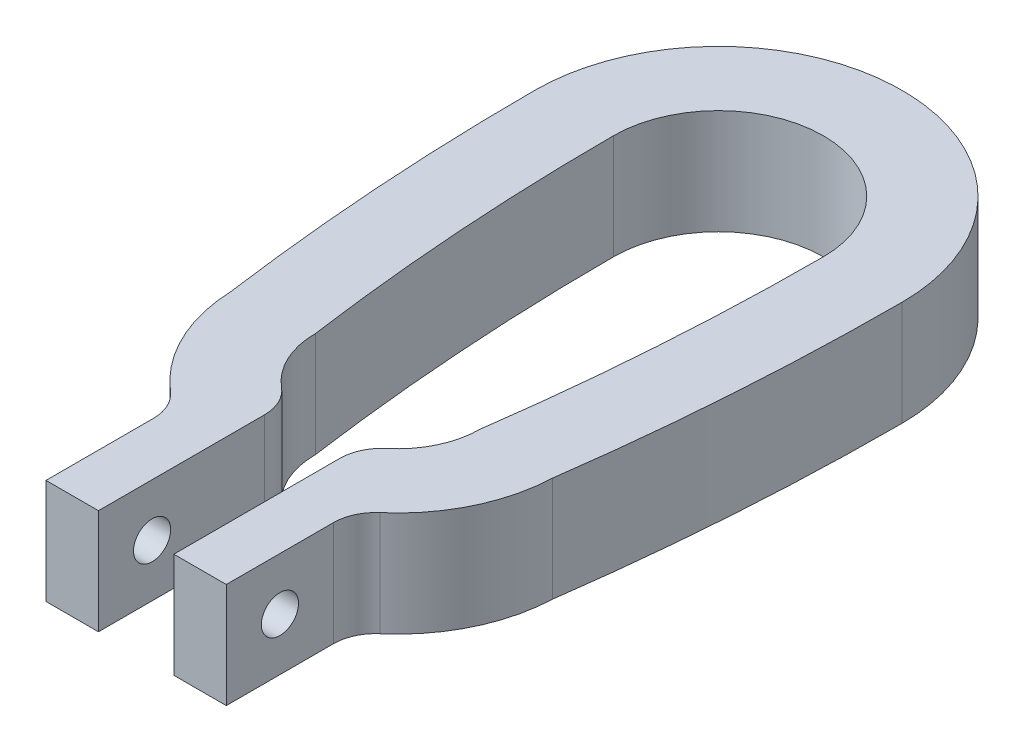
ISO-10303-21;
HEADER;
FILE_DESCRIPTION(('STEP AP214'),'2;1');
FILE_NAME('part.step','',(''),(''),'','','');
FILE_SCHEMA(('AUTOMOTIVE_DESIGN { 1 0 10303 214 1 1 1 1 }'));
ENDSEC;
DATA;
#1=APPLICATION_CONTEXT('core data for automotive mechanical design processes');
#2=APPLICATION_PROTOCOL_DEFINITION('international standard','automotive_design',2000,#1);
#3=PRODUCT_CONTEXT('',#1,'mechanical');
#4=PRODUCT('Part','Part','',(#3));
#5=PRODUCT_RELATED_PRODUCT_CATEGORY('part','',(#4));
#6=PRODUCT_DEFINITION_FORMATION('','',#4);
#7=PRODUCT_DEFINITION_CONTEXT('part definition',#1,'design');
#8=PRODUCT_DEFINITION('design','',#6,#7);
#9=PRODUCT_DEFINITION_SHAPE('','',#8);
#10=(LENGTH_UNIT() NAMED_UNIT(*) SI_UNIT(.MILLI.,.METRE.));
#11=(NAMED_UNIT(*) PLANE_ANGLE_UNIT() SI_UNIT($,.RADIAN.));
#12=(NAMED_UNIT(*) SI_UNIT($,.STERADIAN.) SOLID_ANGLE_UNIT());
#13=UNCERTAINTY_MEASURE_WITH_UNIT(LENGTH_MEASURE(1.E-05),#10,'distance_accuracy_value','');
#14=(GEOMETRIC_REPRESENTATION_CONTEXT(3) GLOBAL_UNCERTAINTY_ASSIGNED_CONTEXT((#13)) GLOBAL_UNIT_ASSIGNED_CONTEXT((#10,
#11,#12)) REPRESENTATION_CONTEXT('',''));
#15=CARTESIAN_POINT('',(0.,0.,0.));
#16=DIRECTION('',(0.,0.,1.));
#17=DIRECTION('',(1.,0.,0.));
#18=AXIS2_PLACEMENT_3D('',#15,#16,#17);
#19=CARTESIAN_POINT('',(0.,12.7,38.8063346560106));
#20=DIRECTION('',(0.,-1.,0.));
#21=DIRECTION('',(0.,0.,-1.));
#22=AXIS2_PLACEMENT_3D('',#19,#20,#21);
#23=CYLINDRICAL_SURFACE('',#22,10.);
#24=CARTESIAN_POINT('',(0.,0.,38.8063346560106));
#25=DIRECTION('',(0.,1.,0.));
#26=DIRECTION('',(0.,0.,1.));
#27=AXIS2_PLACEMENT_3D('',#24,#25,#26);
#28=CIRCLE('',#27,10.);
#29=CARTESIAN_POINT('',(6.3942154467292,0.,46.4948981642877));
#30=VERTEX_POINT('',#29);
#31=CARTESIAN_POINT('',(9.99999999999984,0.,38.8063346560106));
#32=VERTEX_POINT('',#31);
#33=EDGE_CURVE('E219',#30,#32,#28,.T.);
#34=ORIENTED_EDGE('',*,*,#33,.F.);
#35=DIRECTION('',(0.,-1.,0.));
#36=VECTOR('',#35,1.);
#37=CARTESIAN_POINT('',(6.3942154467292,12.7,46.4948981642877));
#38=LINE('',#37,#36);
#39=CARTESIAN_POINT('',(6.3942154467292,12.7,46.4948981642877));
#40=VERTEX_POINT('',#39);
#41=EDGE_CURVE('E11',#40,#30,#38,.T.);
#42=ORIENTED_EDGE('',*,*,#41,.F.);
#43=CARTESIAN_POINT('',(0.,12.7,38.8063346560106));
#44=DIRECTION('',(0.,1.,0.));
#45=DIRECTION('',(0.,0.,1.));
#46=AXIS2_PLACEMENT_3D('',#43,#44,#45);
#47=CIRCLE('',#46,10.);
#48=CARTESIAN_POINT('',(9.99999999999984,12.7,38.8063346560106));
#49=VERTEX_POINT('',#48);
#50=EDGE_CURVE('E291',#40,#49,#47,.T.);
#51=ORIENTED_EDGE('',*,*,#50,.T.);
#52=DIRECTION('',(0.,-1.,0.));
#53=VECTOR('',#52,1.);
#54=CARTESIAN_POINT('',(9.99999999999984,12.7,38.8063346560106));
#55=LINE('',#54,#53);
#56=EDGE_CURVE('E218',#49,#32,#55,.T.);
#57=ORIENTED_EDGE('',*,*,#56,.T.);
#58=EDGE_LOOP('',(#34,#42,#51,#57));
#59=FACE_BOUND('',#58,.T.);
#60=ADVANCED_FACE('F44',(#59),#23,.F.);
#61=CARTESIAN_POINT('',(9.64247689366763,12.7,50.4006884264925));
#62=DIRECTION('',(0.,-1.,0.));
#63=DIRECTION('',(0.,0.,-1.));
#64=AXIS2_PLACEMENT_3D('',#61,#62,#63);
#65=CYLINDRICAL_SURFACE('',#64,5.08);
#66=CARTESIAN_POINT('',(9.64247689366763,0.,50.4006884264925));
#67=DIRECTION('',(0.,-1.,0.));
#68=DIRECTION('',(0.,0.,-1.));
#69=AXIS2_PLACEMENT_3D('',#66,#67,#68);
#70=CIRCLE('',#69,5.08);
#71=CARTESIAN_POINT('',(4.56247689366763,0.,50.4006884264925));
#72=VERTEX_POINT('',#71);
#73=EDGE_CURVE('E289',#72,#30,#70,.T.);
#74=ORIENTED_EDGE('',*,*,#73,.F.);
#75=DIRECTION('',(0.,-1.,0.));
#76=VECTOR('',#75,1.);
#77=CARTESIAN_POINT('',(4.56247689366763,12.7,50.4006884264925));
#78=LINE('',#77,#76);
#79=CARTESIAN_POINT('',(4.56247689366763,12.7,50.4006884264925));
#80=VERTEX_POINT('',#79);
#81=EDGE_CURVE('E54',#80,#72,#78,.T.);
#82=ORIENTED_EDGE('',*,*,#81,.F.);
#83=CARTESIAN_POINT('',(9.64247689366763,12.7,50.4006884264925));
#84=DIRECTION('',(0.,-1.,0.));
#85=DIRECTION('',(0.,0.,-1.));
#86=AXIS2_PLACEMENT_3D('',#83,#84,#85);
#87=CIRCLE('',#86,5.08);
#88=EDGE_CURVE('E193',#80,#40,#87,.T.);
#89=ORIENTED_EDGE('',*,*,#88,.T.);
#90=ORIENTED_EDGE('',*,*,#41,.T.);
#91=EDGE_LOOP('',(#74,#82,#89,#90));
#92=FACE_BOUND('',#91,.T.);
#93=ADVANCED_FACE('F353',(#92),#65,.T.);
#94=CARTESIAN_POINT('',(4.56247689366763,12.7,57.7907869682252));
#95=DIRECTION('',(-1.,0.,0.));
#96=DIRECTION('',(0.,0.,1.));
#97=AXIS2_PLACEMENT_3D('',#94,#95,#96);
#98=PLANE('',#97);
#99=CARTESIAN_POINT('',(4.56247689366762,6.35,63.9979820215499));
#100=DIRECTION('',(-1.,0.,0.));
#101=DIRECTION('',(0.,0.,1.));
#102=AXIS2_PLACEMENT_3D('',#99,#100,#101);
#103=CIRCLE('',#102,2.249999945);
#104=CARTESIAN_POINT('',(4.56247689366762,6.35,66.2479819665499));
#105=VERTEX_POINT('',#104);
#106=EDGE_CURVE('E223',#105,#105,#103,.T.);
#107=ORIENTED_EDGE('',*,*,#106,.F.);
#108=EDGE_LOOP('',(#107));
#109=FACE_BOUND('',#108,.T.);
#110=DIRECTION('',(0.,0.,-1.));
#111=VECTOR('',#110,1.);
#112=CARTESIAN_POINT('',(4.56247689366763,0.,57.7907869682252));
#113=LINE('',#112,#111);
#114=CARTESIAN_POINT('',(4.56247689366764,0.,70.4907869682252));
#115=VERTEX_POINT('',#114);
#116=EDGE_CURVE('E199',#115,#72,#113,.T.);
#117=ORIENTED_EDGE('',*,*,#116,.F.);
#118=DIRECTION('',(0.,-1.,0.));
#119=VECTOR('',#118,1.);
#120=CARTESIAN_POINT('',(4.56247689366764,12.7,70.4907869682252));
#121=LINE('',#120,#119);
#122=CARTESIAN_POINT('',(4.56247689366764,12.7,70.4907869682252));
#123=VERTEX_POINT('',#122);
#124=EDGE_CURVE('E196',#123,#115,#121,.T.);
#125=ORIENTED_EDGE('',*,*,#124,.F.);
#126=DIRECTION('',(0.,0.,1.));
#127=VECTOR('',#126,1.);
#128=CARTESIAN_POINT('',(4.56247689366763,12.7,57.7907869682252));
#129=LINE('',#128,#127);
#130=EDGE_CURVE('E189',#80,#123,#129,.T.);
#131=ORIENTED_EDGE('',*,*,#130,.F.);
#132=ORIENTED_EDGE('',*,*,#81,.T.);
#133=EDGE_LOOP('',(#117,#125,#131,#132));
#134=FACE_BOUND('',#133,.T.);
#135=ADVANCED_FACE('F200',(#109,#134),#98,.T.);
#136=CARTESIAN_POINT('',(4.56247689366764,12.7,70.4907869682252));
#137=DIRECTION('',(0.,0.,-1.));
#138=DIRECTION('',(-1.,0.,0.));
#139=AXIS2_PLACEMENT_3D('',#136,#137,#138);
#140=PLANE('',#139);
#141=DIRECTION('',(1.,0.,0.));
#142=VECTOR('',#141,1.);
#143=CARTESIAN_POINT('',(4.56247689366764,0.,70.4907869682252));
#144=LINE('',#143,#142);
#145=CARTESIAN_POINT('',(10.9124768936676,0.,70.4907869682252));
#146=VERTEX_POINT('',#145);
#147=EDGE_CURVE('E283',#115,#146,#144,.T.);
#148=ORIENTED_EDGE('',*,*,#147,.T.);
#149=DIRECTION('',(0.,-1.,0.));
#150=VECTOR('',#149,1.);
#151=CARTESIAN_POINT('',(10.9124768936676,12.7,70.4907869682252));
#152=LINE('',#151,#150);
#153=CARTESIAN_POINT('',(10.9124768936676,12.7,70.4907869682252));
#154=VERTEX_POINT('',#153);
#155=EDGE_CURVE('E204',#154,#146,#152,.T.);
#156=ORIENTED_EDGE('',*,*,#155,.F.);
#157=DIRECTION('',(1.,0.,0.));
#158=VECTOR('',#157,1.);
#159=CARTESIAN_POINT('',(4.56247689366764,12.7,70.4907869682252));
#160=LINE('',#159,#158);
#161=EDGE_CURVE('E195',#123,#154,#160,.T.);
#162=ORIENTED_EDGE('',*,*,#161,.F.);
#163=ORIENTED_EDGE('',*,*,#124,.T.);
#164=EDGE_LOOP('',(#148,#156,#162,#163));
#165=FACE_BOUND('',#164,.T.);
#166=ADVANCED_FACE('F206',(#165),#140,.F.);
#167=CARTESIAN_POINT('',(10.9124768936676,12.7,70.4907869682252));
#168=DIRECTION('',(-1.,0.,0.));
#169=DIRECTION('',(0.,0.,1.));
#170=AXIS2_PLACEMENT_3D('',#167,#168,#169);
#171=PLANE('',#170);
#172=CARTESIAN_POINT('',(10.9124768936677,6.35,63.9979820215499));
#173=DIRECTION('',(-1.,0.,0.));
#174=DIRECTION('',(0.,0.,1.));
#175=AXIS2_PLACEMENT_3D('',#172,#173,#174);
#176=CIRCLE('',#175,2.249999945);
#177=CARTESIAN_POINT('',(10.9124768936677,6.35,66.2479819665499));
#178=VERTEX_POINT('',#177);
#179=EDGE_CURVE('E452',#178,#178,#176,.T.);
#180=ORIENTED_EDGE('',*,*,#179,.T.);
#181=EDGE_LOOP('',(#180));
#182=FACE_BOUND('',#181,.T.);
#183=DIRECTION('',(0.,0.,-1.));
#184=VECTOR('',#183,1.);
#185=CARTESIAN_POINT('',(10.9124768936676,0.,70.4907869682252));
#186=LINE('',#185,#184);
#187=CARTESIAN_POINT('',(10.9124768936676,0.,57.5051770748746));
#188=VERTEX_POINT('',#187);
#189=EDGE_CURVE('E285',#146,#188,#186,.T.);
#190=ORIENTED_EDGE('',*,*,#189,.T.);
#191=DIRECTION('',(0.,-1.,0.));
#192=VECTOR('',#191,1.);
#193=CARTESIAN_POINT('',(10.9124768936676,12.7,57.5051770748746));
#194=LINE('',#193,#192);
#195=CARTESIAN_POINT('',(10.9124768936676,12.7,57.5051770748746));
#196=VERTEX_POINT('',#195);
#197=EDGE_CURVE('E296',#196,#188,#194,.T.);
#198=ORIENTED_EDGE('',*,*,#197,.F.);
#199=DIRECTION('',(0.,0.,-1.));
#200=VECTOR('',#199,1.);
#201=CARTESIAN_POINT('',(10.9124768936676,12.7,70.4907869682252));
#202=LINE('',#201,#200);
#203=EDGE_CURVE('E209',#154,#196,#202,.T.);
#204=ORIENTED_EDGE('',*,*,#203,.F.);
#205=ORIENTED_EDGE('',*,*,#155,.T.);
#206=EDGE_LOOP('',(#190,#198,#204,#205));
#207=FACE_BOUND('',#206,.T.);
#208=ADVANCED_FACE('F369',(#182,#207),#171,.F.);
#209=CARTESIAN_POINT('',(15.9924768936676,12.7,57.5051770748746));
#210=DIRECTION('',(0.,-1.,0.));
#211=DIRECTION('',(0.,0.,-1.));
#212=AXIS2_PLACEMENT_3D('',#209,#210,#211);
#213=CYLINDRICAL_SURFACE('',#212,5.08);
#214=CARTESIAN_POINT('',(15.9924768936676,0.,57.5051770748746));
#215=DIRECTION('',(0.,-1.,0.));
#216=DIRECTION('',(0.,0.,-1.));
#217=AXIS2_PLACEMENT_3D('',#214,#215,#216);
#218=CIRCLE('',#217,5.08);
#219=CARTESIAN_POINT('',(12.6906365108255,0.,53.644574779088));
#220=VERTEX_POINT('',#219);
#221=EDGE_CURVE('E276',#188,#220,#218,.T.);
#222=ORIENTED_EDGE('',*,*,#221,.T.);
#223=DIRECTION('',(0.,-1.,0.));
#224=VECTOR('',#223,1.);
#225=CARTESIAN_POINT('',(12.6906365108255,12.7,53.644574779088));
#226=LINE('',#225,#224);
#227=CARTESIAN_POINT('',(12.6906365108255,12.7,53.644574779088));
#228=VERTEX_POINT('',#227);
#229=EDGE_CURVE('E302',#228,#220,#226,.T.);
#230=ORIENTED_EDGE('',*,*,#229,.F.);
#231=CARTESIAN_POINT('',(15.9924768936676,12.7,57.5051770748746));
#232=DIRECTION('',(0.,-1.,0.));
#233=DIRECTION('',(0.,0.,-1.));
#234=AXIS2_PLACEMENT_3D('',#231,#232,#233);
#235=CIRCLE('',#234,5.08);
#236=EDGE_CURVE('E213',#196,#228,#235,.T.);
#237=ORIENTED_EDGE('',*,*,#236,.F.);
#238=ORIENTED_EDGE('',*,*,#197,.T.);
#239=EDGE_LOOP('',(#222,#230,#237,#238));
#240=FACE_BOUND('',#239,.T.);
#241=ADVANCED_FACE('F375',(#240),#213,.F.);
#242=CARTESIAN_POINT('',(0.,12.7,38.8063346560106));
#243=DIRECTION('',(0.,-1.,0.));
#244=DIRECTION('',(0.,0.,-1.));
#245=AXIS2_PLACEMENT_3D('',#242,#243,#244);
#246=CYLINDRICAL_SURFACE('',#245,19.5250000000001);
#247=CARTESIAN_POINT('',(0.,0.,38.8063346560106));
#248=DIRECTION('',(0.,1.,0.));
#249=DIRECTION('',(0.,0.,1.));
#250=AXIS2_PLACEMENT_3D('',#247,#248,#249);
#251=CIRCLE('',#250,19.5250000000001);
#252=CARTESIAN_POINT('',(19.5099501596431,0.,39.5728004205738));
#253=VERTEX_POINT('',#252);
#254=EDGE_CURVE('E274',#220,#253,#251,.T.);
#255=ORIENTED_EDGE('',*,*,#254,.T.);
#256=DIRECTION('',(0.,-1.,0.));
#257=VECTOR('',#256,1.);
#258=CARTESIAN_POINT('',(19.5099501596431,12.7,39.5728004205738));
#259=LINE('',#258,#257);
#260=CARTESIAN_POINT('',(19.5099501596431,12.7,39.5728004205738));
#261=VERTEX_POINT('',#260);
#262=EDGE_CURVE('E307',#261,#253,#259,.T.);
#263=ORIENTED_EDGE('',*,*,#262,.F.);
#264=CARTESIAN_POINT('',(0.,12.7,38.8063346560106));
#265=DIRECTION('',(0.,1.,0.));
#266=DIRECTION('',(0.,0.,1.));
#267=AXIS2_PLACEMENT_3D('',#264,#265,#266);
#268=CIRCLE('',#267,19.5250000000001);
#269=EDGE_CURVE('E507',#228,#261,#268,.T.);
#270=ORIENTED_EDGE('',*,*,#269,.F.);
#271=ORIENTED_EDGE('',*,*,#229,.T.);
#272=EDGE_LOOP('',(#255,#263,#270,#271));
#273=FACE_BOUND('',#272,.T.);
#274=ADVANCED_FACE('F376',(#273),#246,.T.);
#275=CARTESIAN_POINT('',(-267.526223969285,12.7,1.59594559789866E-13));
#276=DIRECTION('',(0.,-1.,0.));
#277=DIRECTION('',(0.,0.,-1.));
#278=AXIS2_PLACEMENT_3D('',#275,#276,#277);
#279=CYLINDRICAL_SURFACE('',#278,289.751223969285);
#280=CARTESIAN_POINT('',(-267.526223969285,0.,1.59594559789866E-13));
#281=DIRECTION('',(0.,-1.,0.));
#282=DIRECTION('',(0.,0.,-1.));
#283=AXIS2_PLACEMENT_3D('',#280,#281,#282);
#284=CIRCLE('',#283,289.751223969285);
#285=CARTESIAN_POINT('',(22.2250000000002,0.,0.));
#286=VERTEX_POINT('',#285);
#287=EDGE_CURVE('E271',#286,#253,#284,.T.);
#288=ORIENTED_EDGE('',*,*,#287,.F.);
#289=DIRECTION('',(0.,-1.,0.));
#290=VECTOR('',#289,1.);
#291=CARTESIAN_POINT('',(22.2250000000002,12.7,0.));
#292=LINE('',#291,#290);
#293=CARTESIAN_POINT('',(22.2250000000002,12.7,0.));
#294=VERTEX_POINT('',#293);
#295=EDGE_CURVE('E309',#294,#286,#292,.T.);
#296=ORIENTED_EDGE('',*,*,#295,.F.);
#297=CARTESIAN_POINT('',(-267.526223969285,12.7,1.59594559789866E-13));
#298=DIRECTION('',(0.,-1.,0.));
#299=DIRECTION('',(0.,0.,-1.));
#300=AXIS2_PLACEMENT_3D('',#297,#298,#299);
#301=CIRCLE('',#300,289.751223969285);
#302=EDGE_CURVE('E501',#294,#261,#301,.T.);
#303=ORIENTED_EDGE('',*,*,#302,.T.);
#304=ORIENTED_EDGE('',*,*,#262,.T.);
#305=EDGE_LOOP('',(#288,#296,#303,#304));
#306=FACE_BOUND('',#305,.T.);
#307=ADVANCED_FACE('F379',(#306),#279,.T.);
#308=CARTESIAN_POINT('',(0.,12.7,0.));
#309=DIRECTION('',(0.,-1.,0.));
#310=DIRECTION('',(0.,0.,-1.));
#311=AXIS2_PLACEMENT_3D('',#308,#309,#310);
#312=CYLINDRICAL_SURFACE('',#311,22.225);
#313=CARTESIAN_POINT('',(0.,0.,0.));
#314=DIRECTION('',(0.,1.,0.));
#315=DIRECTION('',(0.,0.,1.));
#316=AXIS2_PLACEMENT_3D('',#313,#314,#315);
#317=CIRCLE('',#316,22.225);
#318=CARTESIAN_POINT('',(-22.225,0.,0.));
#319=VERTEX_POINT('',#318);
#320=EDGE_CURVE('E268',#286,#319,#317,.T.);
#321=ORIENTED_EDGE('',*,*,#320,.T.);
#322=DIRECTION('',(0.,-1.,0.));
#323=VECTOR('',#322,1.);
#324=CARTESIAN_POINT('',(-22.225,12.7,0.));
#325=LINE('',#324,#323);
#326=CARTESIAN_POINT('',(-22.225,12.7,0.));
#327=VERTEX_POINT('',#326);
#328=EDGE_CURVE('E311',#327,#319,#325,.T.);
#329=ORIENTED_EDGE('',*,*,#328,.F.);
#330=CARTESIAN_POINT('',(0.,12.7,0.));
#331=DIRECTION('',(0.,1.,0.));
#332=DIRECTION('',(0.,0.,1.));
#333=AXIS2_PLACEMENT_3D('',#330,#331,#332);
#334=CIRCLE('',#333,22.225);
#335=EDGE_CURVE('E502',#294,#327,#334,.T.);
#336=ORIENTED_EDGE('',*,*,#335,.F.);
#337=ORIENTED_EDGE('',*,*,#295,.T.);
#338=EDGE_LOOP('',(#321,#329,#336,#337));
#339=FACE_BOUND('',#338,.T.);
#340=ADVANCED_FACE('F383',(#339),#312,.T.);
#341=CARTESIAN_POINT('',(267.526223969285,12.7,0.));
#342=DIRECTION('',(0.,-1.,0.));
#343=DIRECTION('',(0.,0.,-1.));
#344=AXIS2_PLACEMENT_3D('',#341,#342,#343);
#345=CYLINDRICAL_SURFACE('',#344,289.751223969285);
#346=CARTESIAN_POINT('',(267.526223969285,0.,0.));
#347=DIRECTION('',(0.,1.,0.));
#348=DIRECTION('',(0.,0.,1.));
#349=AXIS2_PLACEMENT_3D('',#346,#347,#348);
#350=CIRCLE('',#349,289.751223969285);
#351=CARTESIAN_POINT('',(-19.509950159643,0.,39.5728004205737));
#352=VERTEX_POINT('',#351);
#353=EDGE_CURVE('E264',#319,#352,#350,.T.);
#354=ORIENTED_EDGE('',*,*,#353,.T.);
#355=DIRECTION('',(0.,-1.,0.));
#356=VECTOR('',#355,1.);
#357=CARTESIAN_POINT('',(-19.509950159643,12.7,39.5728004205737));
#358=LINE('',#357,#356);
#359=CARTESIAN_POINT('',(-19.509950159643,12.7,39.5728004205737));
#360=VERTEX_POINT('',#359);
#361=EDGE_CURVE('E320',#360,#352,#358,.T.);
#362=ORIENTED_EDGE('',*,*,#361,.F.);
#363=CARTESIAN_POINT('',(267.526223969285,12.7,0.));
#364=DIRECTION('',(0.,1.,0.));
#365=DIRECTION('',(0.,0.,1.));
#366=AXIS2_PLACEMENT_3D('',#363,#364,#365);
#367=CIRCLE('',#366,289.751223969285);
#368=EDGE_CURVE('E499',#327,#360,#367,.T.);
#369=ORIENTED_EDGE('',*,*,#368,.F.);
#370=ORIENTED_EDGE('',*,*,#328,.T.);
#371=EDGE_LOOP('',(#354,#362,#369,#370));
#372=FACE_BOUND('',#371,.T.);
#373=ADVANCED_FACE('F389',(#372),#345,.T.);
#374=CARTESIAN_POINT('',(0.,12.7,38.8063346560106));
#375=DIRECTION('',(0.,-1.,0.));
#376=DIRECTION('',(0.,0.,-1.));
#377=AXIS2_PLACEMENT_3D('',#374,#375,#376);
#378=CYLINDRICAL_SURFACE('',#377,19.5250000000001);
#379=CARTESIAN_POINT('',(0.,0.,38.8063346560106));
#380=DIRECTION('',(0.,1.,0.));
#381=DIRECTION('',(0.,0.,1.));
#382=AXIS2_PLACEMENT_3D('',#379,#380,#381);
#383=CIRCLE('',#382,19.5250000000001);
#384=CARTESIAN_POINT('',(-12.6906365108255,0.,53.6445747790881));
#385=VERTEX_POINT('',#384);
#386=EDGE_CURVE('E261',#352,#385,#383,.T.);
#387=ORIENTED_EDGE('',*,*,#386,.T.);
#388=DIRECTION('',(0.,-1.,0.));
#389=VECTOR('',#388,1.);
#390=CARTESIAN_POINT('',(-12.6906365108255,12.7,53.6445747790881));
#391=LINE('',#390,#389);
#392=CARTESIAN_POINT('',(-12.6906365108255,12.7,53.6445747790881));
#393=VERTEX_POINT('',#392);
#394=EDGE_CURVE('E321',#393,#385,#391,.T.);
#395=ORIENTED_EDGE('',*,*,#394,.F.);
#396=CARTESIAN_POINT('',(0.,12.7,38.8063346560106));
#397=DIRECTION('',(0.,1.,0.));
#398=DIRECTION('',(0.,0.,1.));
#399=AXIS2_PLACEMENT_3D('',#396,#397,#398);
#400=CIRCLE('',#399,19.5250000000001);
#401=EDGE_CURVE('E494',#360,#393,#400,.T.);
#402=ORIENTED_EDGE('',*,*,#401,.F.);
#403=ORIENTED_EDGE('',*,*,#361,.T.);
#404=EDGE_LOOP('',(#387,#395,#402,#403));
#405=FACE_BOUND('',#404,.T.);
#406=ADVANCED_FACE('F395',(#405),#378,.T.);
#407=CARTESIAN_POINT('',(-15.9924768936676,12.7,57.5051770748746));
#408=DIRECTION('',(0.,-1.,0.));
#409=DIRECTION('',(0.,0.,-1.));
#410=AXIS2_PLACEMENT_3D('',#407,#408,#409);
#411=CYLINDRICAL_SURFACE('',#410,5.08);
#412=CARTESIAN_POINT('',(-15.9924768936676,0.,57.5051770748746));
#413=DIRECTION('',(0.,1.,0.));
#414=DIRECTION('',(0.,0.,1.));
#415=AXIS2_PLACEMENT_3D('',#412,#413,#414);
#416=CIRCLE('',#415,5.08);
#417=CARTESIAN_POINT('',(-10.9124768936676,0.,57.5051770748746));
#418=VERTEX_POINT('',#417);
#419=EDGE_CURVE('E260',#418,#385,#416,.T.);
#420=ORIENTED_EDGE('',*,*,#419,.F.);
#421=DIRECTION('',(0.,-1.,0.));
#422=VECTOR('',#421,1.);
#423=CARTESIAN_POINT('',(-10.9124768936676,12.7,57.5051770748746));
#424=LINE('',#423,#422);
#425=CARTESIAN_POINT('',(-10.9124768936676,12.7,57.5051770748746));
#426=VERTEX_POINT('',#425);
#427=EDGE_CURVE('E322',#426,#418,#424,.T.);
#428=ORIENTED_EDGE('',*,*,#427,.F.);
#429=CARTESIAN_POINT('',(-15.9924768936676,12.7,57.5051770748746));
#430=DIRECTION('',(0.,1.,0.));
#431=DIRECTION('',(0.,0.,1.));
#432=AXIS2_PLACEMENT_3D('',#429,#430,#431);
#433=CIRCLE('',#432,5.08);
#434=EDGE_CURVE('E491',#426,#393,#433,.T.);
#435=ORIENTED_EDGE('',*,*,#434,.T.);
#436=ORIENTED_EDGE('',*,*,#394,.T.);
#437=EDGE_LOOP('',(#420,#428,#435,#436));
#438=FACE_BOUND('',#437,.T.);
#439=ADVANCED_FACE('F396',(#438),#411,.F.);
#440=CARTESIAN_POINT('',(-10.9124768936676,12.7,70.4907869682252));
#441=DIRECTION('',(-1.,0.,0.));
#442=DIRECTION('',(0.,0.,1.));
#443=AXIS2_PLACEMENT_3D('',#440,#441,#442);
#444=PLANE('',#443);
#445=CARTESIAN_POINT('',(-10.9124768936676,6.35,63.9979820215499));
#446=DIRECTION('',(-1.,0.,0.));
#447=DIRECTION('',(0.,0.,1.));
#448=AXIS2_PLACEMENT_3D('',#445,#446,#447);
#449=CIRCLE('',#448,2.249999945);
#450=CARTESIAN_POINT('',(-10.9124768936676,6.35,66.2479819665499));
#451=VERTEX_POINT('',#450);
#452=EDGE_CURVE('E446',#451,#451,#449,.T.);
#453=ORIENTED_EDGE('',*,*,#452,.F.);
#454=EDGE_LOOP('',(#453));
#455=FACE_BOUND('',#454,.T.);
#456=DIRECTION('',(0.,0.,-1.));
#457=VECTOR('',#456,1.);
#458=CARTESIAN_POINT('',(-10.9124768936676,0.,70.4907869682252));
#459=LINE('',#458,#457);
#460=CARTESIAN_POINT('',(-10.9124768936676,0.,70.4907869682252));
#461=VERTEX_POINT('',#460);
#462=EDGE_CURVE('E251',#461,#418,#459,.T.);
#463=ORIENTED_EDGE('',*,*,#462,.F.);
#464=DIRECTION('',(0.,-1.,0.));
#465=VECTOR('',#464,1.);
#466=CARTESIAN_POINT('',(-10.9124768936676,12.7,70.4907869682252));
#467=LINE('',#466,#465);
#468=CARTESIAN_POINT('',(-10.9124768936676,12.7,70.4907869682252));
#469=VERTEX_POINT('',#468);
#470=EDGE_CURVE('E330',#469,#461,#467,.T.);
#471=ORIENTED_EDGE('',*,*,#470,.F.);
#472=DIRECTION('',(0.,0.,-1.));
#473=VECTOR('',#472,1.);
#474=CARTESIAN_POINT('',(-10.9124768936676,12.7,70.4907869682252));
#475=LINE('',#474,#473);
#476=EDGE_CURVE('E490',#469,#426,#475,.T.);
#477=ORIENTED_EDGE('',*,*,#476,.T.);
#478=ORIENTED_EDGE('',*,*,#427,.T.);
#479=EDGE_LOOP('',(#463,#471,#477,#478));
#480=FACE_BOUND('',#479,.T.);
#481=ADVANCED_FACE('F399',(#455,#480),#444,.T.);
#482=CARTESIAN_POINT('',(-4.56247689366762,12.7,70.4907869682252));
#483=DIRECTION('',(0.,0.,1.));
#484=DIRECTION('',(1.,0.,0.));
#485=AXIS2_PLACEMENT_3D('',#482,#483,#484);
#486=PLANE('',#485);
#487=DIRECTION('',(-1.,0.,0.));
#488=VECTOR('',#487,1.);
#489=CARTESIAN_POINT('',(-4.56247689366762,0.,70.4907869682252));
#490=LINE('',#489,#488);
#491=CARTESIAN_POINT('',(-4.56247689366762,0.,70.4907869682252));
#492=VERTEX_POINT('',#491);
#493=EDGE_CURVE('E248',#492,#461,#490,.T.);
#494=ORIENTED_EDGE('',*,*,#493,.F.);
#495=DIRECTION('',(0.,-1.,0.));
#496=VECTOR('',#495,1.);
#497=CARTESIAN_POINT('',(-4.56247689366762,12.7,70.4907869682252));
#498=LINE('',#497,#496);
#499=CARTESIAN_POINT('',(-4.56247689366762,12.7,70.4907869682252));
#500=VERTEX_POINT('',#499);
#501=EDGE_CURVE('E329',#500,#492,#498,.T.);
#502=ORIENTED_EDGE('',*,*,#501,.F.);
#503=DIRECTION('',(-1.,0.,0.));
#504=VECTOR('',#503,1.);
#505=CARTESIAN_POINT('',(-4.56247689366762,12.7,70.4907869682252));
#506=LINE('',#505,#504);
#507=EDGE_CURVE('E483',#500,#469,#506,.T.);
#508=ORIENTED_EDGE('',*,*,#507,.T.);
#509=ORIENTED_EDGE('',*,*,#470,.T.);
#510=EDGE_LOOP('',(#494,#502,#508,#509));
#511=FACE_BOUND('',#510,.T.);
#512=ADVANCED_FACE('F404',(#511),#486,.T.);
#513=CARTESIAN_POINT('',(-4.56247689366761,12.7,57.7907869682252));
#514=DIRECTION('',(1.,0.,0.));
#515=DIRECTION('',(0.,0.,-1.));
#516=AXIS2_PLACEMENT_3D('',#513,#514,#515);
#517=PLANE('',#516);
#518=CARTESIAN_POINT('',(-4.56247689366762,6.35,63.9979820215499));
#519=DIRECTION('',(1.,0.,0.));
#520=DIRECTION('',(0.,0.,-1.));
#521=AXIS2_PLACEMENT_3D('',#518,#519,#520);
#522=CIRCLE('',#521,2.249999945);
#523=CARTESIAN_POINT('',(-4.56247689366762,6.35,61.7479820765499));
#524=VERTEX_POINT('',#523);
#525=EDGE_CURVE('E48',#524,#524,#522,.T.);
#526=ORIENTED_EDGE('',*,*,#525,.F.);
#527=EDGE_LOOP('',(#526));
#528=FACE_BOUND('',#527,.T.);
#529=DIRECTION('',(0.,0.,1.));
#530=VECTOR('',#529,1.);
#531=CARTESIAN_POINT('',(-4.56247689366761,0.,57.7907869682252));
#532=LINE('',#531,#530);
#533=CARTESIAN_POINT('',(-4.56247689366761,0.,50.4006884264925));
#534=VERTEX_POINT('',#533);
#535=EDGE_CURVE('E243',#534,#492,#532,.T.);
#536=ORIENTED_EDGE('',*,*,#535,.F.);
#537=DIRECTION('',(0.,-1.,0.));
#538=VECTOR('',#537,1.);
#539=CARTESIAN_POINT('',(-4.56247689366761,12.7,50.4006884264925));
#540=LINE('',#539,#538);
#541=CARTESIAN_POINT('',(-4.56247689366761,12.7,50.4006884264925));
#542=VERTEX_POINT('',#541);
#543=EDGE_CURVE('E334',#542,#534,#540,.T.);
#544=ORIENTED_EDGE('',*,*,#543,.F.);
#545=DIRECTION('',(0.,0.,-1.));
#546=VECTOR('',#545,1.);
#547=CARTESIAN_POINT('',(-4.56247689366761,12.7,57.7907869682252));
#548=LINE('',#547,#546);
#549=EDGE_CURVE('E477',#500,#542,#548,.T.);
#550=ORIENTED_EDGE('',*,*,#549,.F.);
#551=ORIENTED_EDGE('',*,*,#501,.T.);
#552=EDGE_LOOP('',(#536,#544,#550,#551));
#553=FACE_BOUND('',#552,.T.);
#554=ADVANCED_FACE('F409',(#528,#553),#517,.T.);
#555=CARTESIAN_POINT('',(-9.64247689366761,12.7,50.4006884264925));
#556=DIRECTION('',(0.,-1.,0.));
#557=DIRECTION('',(0.,0.,-1.));
#558=AXIS2_PLACEMENT_3D('',#555,#556,#557);
#559=CYLINDRICAL_SURFACE('',#558,5.08);
#560=CARTESIAN_POINT('',(-9.64247689366761,0.,50.4006884264925));
#561=DIRECTION('',(0.,1.,0.));
#562=DIRECTION('',(0.,0.,1.));
#563=AXIS2_PLACEMENT_3D('',#560,#561,#562);
#564=CIRCLE('',#563,5.08);
#565=CARTESIAN_POINT('',(-6.39421544672919,0.,46.4948981642877));
#566=VERTEX_POINT('',#565);
#567=EDGE_CURVE('E242',#534,#566,#564,.T.);
#568=ORIENTED_EDGE('',*,*,#567,.T.);
#569=DIRECTION('',(0.,-1.,0.));
#570=VECTOR('',#569,1.);
#571=CARTESIAN_POINT('',(-6.39421544672919,12.7,46.4948981642877));
#572=LINE('',#571,#570);
#573=CARTESIAN_POINT('',(-6.39421544672919,12.7,46.4948981642877));
#574=VERTEX_POINT('',#573);
#575=EDGE_CURVE('E340',#574,#566,#572,.T.);
#576=ORIENTED_EDGE('',*,*,#575,.F.);
#577=CARTESIAN_POINT('',(-9.64247689366761,12.7,50.4006884264925));
#578=DIRECTION('',(0.,1.,0.));
#579=DIRECTION('',(0.,0.,1.));
#580=AXIS2_PLACEMENT_3D('',#577,#578,#579);
#581=CIRCLE('',#580,5.08);
#582=EDGE_CURVE('E480',#542,#574,#581,.T.);
#583=ORIENTED_EDGE('',*,*,#582,.F.);
#584=ORIENTED_EDGE('',*,*,#543,.T.);
#585=EDGE_LOOP('',(#568,#576,#583,#584));
#586=FACE_BOUND('',#585,.T.);
#587=ADVANCED_FACE('F415',(#586),#559,.T.);
#588=CARTESIAN_POINT('',(0.,12.7,38.8063346560106));
#589=DIRECTION('',(0.,-1.,0.));
#590=DIRECTION('',(0.,0.,-1.));
#591=AXIS2_PLACEMENT_3D('',#588,#589,#590);
#592=CYLINDRICAL_SURFACE('',#591,10.);
#593=CARTESIAN_POINT('',(0.,0.,38.8063346560106));
#594=DIRECTION('',(0.,1.,0.));
#595=DIRECTION('',(0.,0.,1.));
#596=AXIS2_PLACEMENT_3D('',#593,#594,#595);
#597=CIRCLE('',#596,10.);
#598=CARTESIAN_POINT('',(-10.,0.,38.8063346560106));
#599=VERTEX_POINT('',#598);
#600=EDGE_CURVE('E240',#599,#566,#597,.T.);
#601=ORIENTED_EDGE('',*,*,#600,.F.);
#602=DIRECTION('',(0.,-1.,0.));
#603=VECTOR('',#602,1.);
#604=CARTESIAN_POINT('',(-10.,12.7,38.8063346560106));
#605=LINE('',#604,#603);
#606=CARTESIAN_POINT('',(-10.,12.7,38.8063346560106));
#607=VERTEX_POINT('',#606);
#608=EDGE_CURVE('E338',#607,#599,#605,.T.);
#609=ORIENTED_EDGE('',*,*,#608,.F.);
#610=CARTESIAN_POINT('',(0.,12.7,38.8063346560106));
#611=DIRECTION('',(0.,1.,0.));
#612=DIRECTION('',(0.,0.,1.));
#613=AXIS2_PLACEMENT_3D('',#610,#611,#612);
#614=CIRCLE('',#613,10.);
#615=EDGE_CURVE('E471',#607,#574,#614,.T.);
#616=ORIENTED_EDGE('',*,*,#615,.T.);
#617=ORIENTED_EDGE('',*,*,#575,.T.);
#618=EDGE_LOOP('',(#601,#609,#616,#617));
#619=FACE_BOUND('',#618,.T.);
#620=ADVANCED_FACE('F418',(#619),#592,.F.);
#621=CARTESIAN_POINT('',(267.526223969285,12.7,0.));
#622=DIRECTION('',(0.,-1.,0.));
#623=DIRECTION('',(0.,0.,-1.));
#624=AXIS2_PLACEMENT_3D('',#621,#622,#623);
#625=CYLINDRICAL_SURFACE('',#624,280.226223969285);
#626=CARTESIAN_POINT('',(267.526223969285,0.,0.));
#627=DIRECTION('',(0.,1.,0.));
#628=DIRECTION('',(0.,0.,1.));
#629=AXIS2_PLACEMENT_3D('',#626,#627,#628);
#630=CIRCLE('',#629,280.226223969285);
#631=CARTESIAN_POINT('',(-12.7000000000001,0.,0.));
#632=VERTEX_POINT('',#631);
#633=EDGE_CURVE('E232',#632,#599,#630,.T.);
#634=ORIENTED_EDGE('',*,*,#633,.F.);
#635=DIRECTION('',(0.,-1.,0.));
#636=VECTOR('',#635,1.);
#637=CARTESIAN_POINT('',(-12.7000000000001,12.7,0.));
#638=LINE('',#637,#636);
#639=CARTESIAN_POINT('',(-12.7000000000001,12.7,0.));
#640=VERTEX_POINT('',#639);
#641=EDGE_CURVE('E342',#640,#632,#638,.T.);
#642=ORIENTED_EDGE('',*,*,#641,.F.);
#643=CARTESIAN_POINT('',(267.526223969285,12.7,0.));
#644=DIRECTION('',(0.,1.,0.));
#645=DIRECTION('',(0.,0.,1.));
#646=AXIS2_PLACEMENT_3D('',#643,#644,#645);
#647=CIRCLE('',#646,280.226223969285);
#648=EDGE_CURVE('E468',#640,#607,#647,.T.);
#649=ORIENTED_EDGE('',*,*,#648,.T.);
#650=ORIENTED_EDGE('',*,*,#608,.T.);
#651=EDGE_LOOP('',(#634,#642,#649,#650));
#652=FACE_BOUND('',#651,.T.);
#653=ADVANCED_FACE('F419',(#652),#625,.F.);
#654=CARTESIAN_POINT('',(0.,12.7,0.));
#655=DIRECTION('',(0.,-1.,0.));
#656=DIRECTION('',(0.,0.,-1.));
#657=AXIS2_PLACEMENT_3D('',#654,#655,#656);
#658=CYLINDRICAL_SURFACE('',#657,12.7);
#659=CARTESIAN_POINT('',(0.,0.,0.));
#660=DIRECTION('',(0.,1.,0.));
#661=DIRECTION('',(0.,0.,1.));
#662=AXIS2_PLACEMENT_3D('',#659,#660,#661);
#663=CIRCLE('',#662,12.7);
#664=CARTESIAN_POINT('',(12.7,0.,0.));
#665=VERTEX_POINT('',#664);
#666=EDGE_CURVE('E226',#665,#632,#663,.T.);
#667=ORIENTED_EDGE('',*,*,#666,.F.);
#668=DIRECTION('',(0.,-1.,0.));
#669=VECTOR('',#668,1.);
#670=CARTESIAN_POINT('',(12.7,12.7,0.));
#671=LINE('',#670,#669);
#672=CARTESIAN_POINT('',(12.7,12.7,0.));
#673=VERTEX_POINT('',#672);
#674=EDGE_CURVE('E347',#673,#665,#671,.T.);
#675=ORIENTED_EDGE('',*,*,#674,.F.);
#676=CARTESIAN_POINT('',(0.,12.7,0.));
#677=DIRECTION('',(0.,1.,0.));
#678=DIRECTION('',(0.,0.,1.));
#679=AXIS2_PLACEMENT_3D('',#676,#677,#678);
#680=CIRCLE('',#679,12.7);
#681=EDGE_CURVE('E463',#673,#640,#680,.T.);
#682=ORIENTED_EDGE('',*,*,#681,.T.);
#683=ORIENTED_EDGE('',*,*,#641,.T.);
#684=EDGE_LOOP('',(#667,#675,#682,#683));
#685=FACE_BOUND('',#684,.T.);
#686=ADVANCED_FACE('F424',(#685),#658,.F.);
#687=CARTESIAN_POINT('',(-267.526223969285,12.7,1.59594559789866E-13));
#688=DIRECTION('',(0.,-1.,0.));
#689=DIRECTION('',(0.,0.,-1.));
#690=AXIS2_PLACEMENT_3D('',#687,#688,#689);
#691=CYLINDRICAL_SURFACE('',#690,280.226223969285);
#692=CARTESIAN_POINT('',(-267.526223969285,0.,1.59594559789866E-13));
#693=DIRECTION('',(0.,-1.,0.));
#694=DIRECTION('',(0.,0.,-1.));
#695=AXIS2_PLACEMENT_3D('',#692,#693,#694);
#696=CIRCLE('',#695,280.226223969285);
#697=EDGE_CURVE('E221',#665,#32,#696,.T.);
#698=ORIENTED_EDGE('',*,*,#697,.T.);
#699=ORIENTED_EDGE('',*,*,#56,.F.);
#700=CARTESIAN_POINT('',(-267.526223969285,12.7,1.59594559789866E-13));
#701=DIRECTION('',(0.,-1.,0.));
#702=DIRECTION('',(0.,0.,-1.));
#703=AXIS2_PLACEMENT_3D('',#700,#701,#702);
#704=CIRCLE('',#703,280.226223969285);
#705=EDGE_CURVE('E140',#673,#49,#704,.T.);
#706=ORIENTED_EDGE('',*,*,#705,.F.);
#707=ORIENTED_EDGE('',*,*,#674,.T.);
#708=EDGE_LOOP('',(#698,#699,#706,#707));
#709=FACE_BOUND('',#708,.T.);
#710=ADVANCED_FACE('F352',(#709),#691,.F.);
#711=CARTESIAN_POINT('',(0.,12.7,38.8063346560106));
#712=DIRECTION('',(0.,1.,0.));
#713=DIRECTION('',(0.,0.,1.));
#714=AXIS2_PLACEMENT_3D('',#711,#712,#713);
#715=PLANE('',#714);
#716=ORIENTED_EDGE('',*,*,#50,.F.);
#717=ORIENTED_EDGE('',*,*,#88,.F.);
#718=ORIENTED_EDGE('',*,*,#130,.T.);
#719=ORIENTED_EDGE('',*,*,#161,.T.);
#720=ORIENTED_EDGE('',*,*,#203,.T.);
#721=ORIENTED_EDGE('',*,*,#236,.T.);
#722=ORIENTED_EDGE('',*,*,#269,.T.);
#723=ORIENTED_EDGE('',*,*,#302,.F.);
#724=ORIENTED_EDGE('',*,*,#335,.T.);
#725=ORIENTED_EDGE('',*,*,#368,.T.);
#726=ORIENTED_EDGE('',*,*,#401,.T.);
#727=ORIENTED_EDGE('',*,*,#434,.F.);
#728=ORIENTED_EDGE('',*,*,#476,.F.);
#729=ORIENTED_EDGE('',*,*,#507,.F.);
#730=ORIENTED_EDGE('',*,*,#549,.T.);
#731=ORIENTED_EDGE('',*,*,#582,.T.);
#732=ORIENTED_EDGE('',*,*,#615,.F.);
#733=ORIENTED_EDGE('',*,*,#648,.F.);
#734=ORIENTED_EDGE('',*,*,#681,.F.);
#735=ORIENTED_EDGE('',*,*,#705,.T.);
#736=EDGE_LOOP('',(#716,#717,#718,#719,#720,#721,#722,#723,#724,#725,#726,#727,#728,#729,#730,
#731,#732,#733,#734,#735));
#737=FACE_BOUND('',#736,.T.);
#738=ADVANCED_FACE('F188',(#737),#715,.T.);
#739=CARTESIAN_POINT('',(0.,0.,38.8063346560106));
#740=DIRECTION('',(0.,1.,0.));
#741=DIRECTION('',(0.,0.,1.));
#742=AXIS2_PLACEMENT_3D('',#739,#740,#741);
#743=PLANE('',#742);
#744=ORIENTED_EDGE('',*,*,#33,.T.);
#745=ORIENTED_EDGE('',*,*,#697,.F.);
#746=ORIENTED_EDGE('',*,*,#666,.T.);
#747=ORIENTED_EDGE('',*,*,#633,.T.);
#748=ORIENTED_EDGE('',*,*,#600,.T.);
#749=ORIENTED_EDGE('',*,*,#567,.F.);
#750=ORIENTED_EDGE('',*,*,#535,.T.);
#751=ORIENTED_EDGE('',*,*,#493,.T.);
#752=ORIENTED_EDGE('',*,*,#462,.T.);
#753=ORIENTED_EDGE('',*,*,#419,.T.);
#754=ORIENTED_EDGE('',*,*,#386,.F.);
#755=ORIENTED_EDGE('',*,*,#353,.F.);
#756=ORIENTED_EDGE('',*,*,#320,.F.);
#757=ORIENTED_EDGE('',*,*,#287,.T.);
#758=ORIENTED_EDGE('',*,*,#254,.F.);
#759=ORIENTED_EDGE('',*,*,#221,.F.);
#760=ORIENTED_EDGE('',*,*,#189,.F.);
#761=ORIENTED_EDGE('',*,*,#147,.F.);
#762=ORIENTED_EDGE('',*,*,#116,.T.);
#763=ORIENTED_EDGE('',*,*,#73,.T.);
#764=EDGE_LOOP('',(#744,#745,#746,#747,#748,#749,#750,#751,#752,#753,#754,#755,#756,#757,#758,
#759,#760,#761,#762,#763));
#765=FACE_BOUND('',#764,.T.);
#766=ADVANCED_FACE('F351',(#765),#743,.F.);
#767=CARTESIAN_POINT('',(1386.08752310633,6.35,63.9979820215501));
#768=DIRECTION('',(-1.,0.,0.));
#769=DIRECTION('',(0.,0.,1.));
#770=AXIS2_PLACEMENT_3D('',#767,#768,#769);
#771=CYLINDRICAL_SURFACE('',#770,2.249999945);
#772=ORIENTED_EDGE('',*,*,#525,.T.);
#773=EDGE_LOOP('',(#772));
#774=FACE_BOUND('',#773,.T.);
#775=ORIENTED_EDGE('',*,*,#452,.T.);
#776=EDGE_LOOP('',(#775));
#777=FACE_BOUND('',#776,.T.);
#778=ADVANCED_FACE('F434',(#774,#777),#771,.F.);
#779=ORIENTED_EDGE('',*,*,#106,.T.);
#780=EDGE_LOOP('',(#779));
#781=FACE_BOUND('',#780,.T.);
#782=ORIENTED_EDGE('',*,*,#179,.F.);
#783=EDGE_LOOP('',(#782));
#784=FACE_BOUND('',#783,.T.);
#785=ADVANCED_FACE('F437',(#781,#784),#771,.F.);
#786=CLOSED_SHELL('',(#60,#93,#135,#166,#208,#241,#274,#307,#340,#373,#406,#439,#481,#512,#554,
#587,#620,#653,#686,#710,#738,#766,#778,#785));
#787=MANIFOLD_SOLID_BREP('B2',#786);
#788=ADVANCED_BREP_SHAPE_REPRESENTATION('',(#18,#787),#14);
#789=SHAPE_DEFINITION_REPRESENTATION(#9,#788);
ENDSEC;
END-ISO-10303-21;
